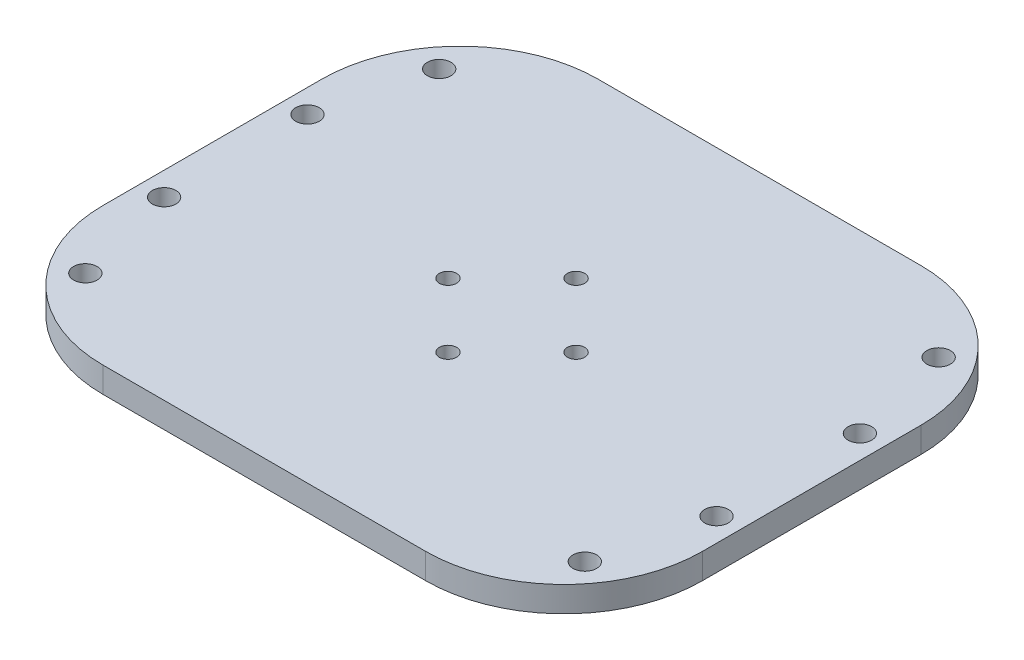
ISO-10303-21;
HEADER;
FILE_DESCRIPTION(('STEP AP214'),'2;1');
FILE_NAME('part.step','',(''),(''),'','','');
FILE_SCHEMA(('AUTOMOTIVE_DESIGN { 1 0 10303 214 1 1 1 1 }'));
ENDSEC;
DATA;
#1=APPLICATION_CONTEXT('core data for automotive mechanical design processes');
#2=APPLICATION_PROTOCOL_DEFINITION('international standard','automotive_design',2000,#1);
#3=PRODUCT_CONTEXT('',#1,'mechanical');
#4=PRODUCT('Part','Part','',(#3));
#5=PRODUCT_RELATED_PRODUCT_CATEGORY('part','',(#4));
#6=PRODUCT_DEFINITION_FORMATION('','',#4);
#7=PRODUCT_DEFINITION_CONTEXT('part definition',#1,'design');
#8=PRODUCT_DEFINITION('design','',#6,#7);
#9=PRODUCT_DEFINITION_SHAPE('','',#8);
#10=(LENGTH_UNIT() NAMED_UNIT(*) SI_UNIT(.MILLI.,.METRE.));
#11=(NAMED_UNIT(*) PLANE_ANGLE_UNIT() SI_UNIT($,.RADIAN.));
#12=(NAMED_UNIT(*) SI_UNIT($,.STERADIAN.) SOLID_ANGLE_UNIT());
#13=UNCERTAINTY_MEASURE_WITH_UNIT(LENGTH_MEASURE(1.E-05),#10,'distance_accuracy_value','');
#14=(GEOMETRIC_REPRESENTATION_CONTEXT(3) GLOBAL_UNCERTAINTY_ASSIGNED_CONTEXT((#13)) GLOBAL_UNIT_ASSIGNED_CONTEXT((#10,
#11,#12)) REPRESENTATION_CONTEXT('',''));
#15=CARTESIAN_POINT('',(0.,0.,0.));
#16=DIRECTION('',(0.,0.,1.));
#17=DIRECTION('',(1.,0.,0.));
#18=AXIS2_PLACEMENT_3D('',#15,#16,#17);
#19=CARTESIAN_POINT('',(20.150112608,3.175,-13.647712608));
#20=DIRECTION('',(0.,-1.,0.));
#21=DIRECTION('',(0.,0.,-1.));
#22=AXIS2_PLACEMENT_3D('',#19,#20,#21);
#23=CYLINDRICAL_SURFACE('',#22,17.276787392);
#24=CARTESIAN_POINT('',(20.150112608,0.,-13.647712608));
#25=DIRECTION('',(0.,1.,0.));
#26=DIRECTION('',(0.,0.,1.));
#27=AXIS2_PLACEMENT_3D('',#24,#25,#26);
#28=CIRCLE('',#27,17.276787392);
#29=CARTESIAN_POINT('',(37.4269,0.,-13.647712608));
#30=VERTEX_POINT('',#29);
#31=CARTESIAN_POINT('',(20.150112608,0.,-30.9245));
#32=VERTEX_POINT('',#31);
#33=EDGE_CURVE('E128',#30,#32,#28,.T.);
#34=ORIENTED_EDGE('',*,*,#33,.T.);
#35=DIRECTION('',(0.,-1.,0.));
#36=VECTOR('',#35,1.);
#37=CARTESIAN_POINT('',(20.150112608,3.175,-30.9245));
#38=LINE('',#37,#36);
#39=CARTESIAN_POINT('',(20.150112608,3.175,-30.9245));
#40=VERTEX_POINT('',#39);
#41=EDGE_CURVE('E11',#40,#32,#38,.T.);
#42=ORIENTED_EDGE('',*,*,#41,.F.);
#43=CARTESIAN_POINT('',(20.150112608,3.175,-13.647712608));
#44=DIRECTION('',(0.,1.,0.));
#45=DIRECTION('',(0.,0.,1.));
#46=AXIS2_PLACEMENT_3D('',#43,#44,#45);
#47=CIRCLE('',#46,17.276787392);
#48=CARTESIAN_POINT('',(37.4269,3.175,-13.647712608));
#49=VERTEX_POINT('',#48);
#50=EDGE_CURVE('E143',#49,#40,#47,.T.);
#51=ORIENTED_EDGE('',*,*,#50,.F.);
#52=DIRECTION('',(0.,-1.,0.));
#53=VECTOR('',#52,1.);
#54=CARTESIAN_POINT('',(37.4269,3.175,-13.647712608));
#55=LINE('',#54,#53);
#56=EDGE_CURVE('E124',#49,#30,#55,.T.);
#57=ORIENTED_EDGE('',*,*,#56,.T.);
#58=EDGE_LOOP('',(#34,#42,#51,#57));
#59=FACE_BOUND('',#58,.T.);
#60=ADVANCED_FACE('F32',(#59),#23,.T.);
#61=CARTESIAN_POINT('',(20.150112608,3.175,-30.9245));
#62=DIRECTION('',(0.,0.,1.));
#63=DIRECTION('',(1.,0.,0.));
#64=AXIS2_PLACEMENT_3D('',#61,#62,#63);
#65=PLANE('',#64);
#66=DIRECTION('',(-1.,0.,0.));
#67=VECTOR('',#66,1.);
#68=CARTESIAN_POINT('',(20.150112608,0.,-30.9245));
#69=LINE('',#68,#67);
#70=CARTESIAN_POINT('',(-20.150112608,0.,-30.9245));
#71=VERTEX_POINT('',#70);
#72=EDGE_CURVE('E131',#32,#71,#69,.T.);
#73=ORIENTED_EDGE('',*,*,#72,.T.);
#74=DIRECTION('',(0.,-1.,0.));
#75=VECTOR('',#74,1.);
#76=CARTESIAN_POINT('',(-20.150112608,3.175,-30.9245));
#77=LINE('',#76,#75);
#78=CARTESIAN_POINT('',(-20.150112608,3.175,-30.9245));
#79=VERTEX_POINT('',#78);
#80=EDGE_CURVE('E40',#79,#71,#77,.T.);
#81=ORIENTED_EDGE('',*,*,#80,.F.);
#82=DIRECTION('',(-1.,0.,0.));
#83=VECTOR('',#82,1.);
#84=CARTESIAN_POINT('',(20.150112608,3.175,-30.9245));
#85=LINE('',#84,#83);
#86=EDGE_CURVE('E91',#40,#79,#85,.T.);
#87=ORIENTED_EDGE('',*,*,#86,.F.);
#88=ORIENTED_EDGE('',*,*,#41,.T.);
#89=EDGE_LOOP('',(#73,#81,#87,#88));
#90=FACE_BOUND('',#89,.T.);
#91=ADVANCED_FACE('F292',(#90),#65,.F.);
#92=CARTESIAN_POINT('',(-20.150112608,3.175,-13.647712608));
#93=DIRECTION('',(0.,-1.,0.));
#94=DIRECTION('',(0.,0.,-1.));
#95=AXIS2_PLACEMENT_3D('',#92,#93,#94);
#96=CYLINDRICAL_SURFACE('',#95,17.276787392);
#97=CARTESIAN_POINT('',(-20.150112608,0.,-13.647712608));
#98=DIRECTION('',(0.,1.,0.));
#99=DIRECTION('',(0.,0.,1.));
#100=AXIS2_PLACEMENT_3D('',#97,#98,#99);
#101=CIRCLE('',#100,17.276787392);
#102=CARTESIAN_POINT('',(-37.4269,0.,-13.647712608));
#103=VERTEX_POINT('',#102);
#104=EDGE_CURVE('E134',#71,#103,#101,.T.);
#105=ORIENTED_EDGE('',*,*,#104,.T.);
#106=DIRECTION('',(0.,-1.,0.));
#107=VECTOR('',#106,1.);
#108=CARTESIAN_POINT('',(-37.4269,3.175,-13.647712608));
#109=LINE('',#108,#107);
#110=CARTESIAN_POINT('',(-37.4269,3.175,-13.647712608));
#111=VERTEX_POINT('',#110);
#112=EDGE_CURVE('E150',#111,#103,#109,.T.);
#113=ORIENTED_EDGE('',*,*,#112,.F.);
#114=CARTESIAN_POINT('',(-20.150112608,3.175,-13.647712608));
#115=DIRECTION('',(0.,1.,0.));
#116=DIRECTION('',(0.,0.,1.));
#117=AXIS2_PLACEMENT_3D('',#114,#115,#116);
#118=CIRCLE('',#117,17.276787392);
#119=EDGE_CURVE('E158',#79,#111,#118,.T.);
#120=ORIENTED_EDGE('',*,*,#119,.F.);
#121=ORIENTED_EDGE('',*,*,#80,.T.);
#122=EDGE_LOOP('',(#105,#113,#120,#121));
#123=FACE_BOUND('',#122,.T.);
#124=ADVANCED_FACE('F156',(#123),#96,.T.);
#125=CARTESIAN_POINT('',(-37.4269,3.175,13.647712608));
#126=DIRECTION('',(1.,0.,0.));
#127=DIRECTION('',(0.,0.,-1.));
#128=AXIS2_PLACEMENT_3D('',#125,#126,#127);
#129=PLANE('',#128);
#130=DIRECTION('',(0.,0.,1.));
#131=VECTOR('',#130,1.);
#132=CARTESIAN_POINT('',(-37.4269,0.,13.647712608));
#133=LINE('',#132,#131);
#134=CARTESIAN_POINT('',(-37.4269,0.,13.647712608));
#135=VERTEX_POINT('',#134);
#136=EDGE_CURVE('E136',#103,#135,#133,.T.);
#137=ORIENTED_EDGE('',*,*,#136,.T.);
#138=DIRECTION('',(0.,-1.,0.));
#139=VECTOR('',#138,1.);
#140=CARTESIAN_POINT('',(-37.4269,3.175,13.647712608));
#141=LINE('',#140,#139);
#142=CARTESIAN_POINT('',(-37.4269,3.175,13.647712608));
#143=VERTEX_POINT('',#142);
#144=EDGE_CURVE('E147',#143,#135,#141,.T.);
#145=ORIENTED_EDGE('',*,*,#144,.F.);
#146=DIRECTION('',(0.,0.,1.));
#147=VECTOR('',#146,1.);
#148=CARTESIAN_POINT('',(-37.4269,3.175,13.647712608));
#149=LINE('',#148,#147);
#150=EDGE_CURVE('E170',#111,#143,#149,.T.);
#151=ORIENTED_EDGE('',*,*,#150,.F.);
#152=ORIENTED_EDGE('',*,*,#112,.T.);
#153=EDGE_LOOP('',(#137,#145,#151,#152));
#154=FACE_BOUND('',#153,.T.);
#155=ADVANCED_FACE('F166',(#154),#129,.F.);
#156=CARTESIAN_POINT('',(-20.150112608,3.175,13.647712608));
#157=DIRECTION('',(0.,-1.,0.));
#158=DIRECTION('',(0.,0.,-1.));
#159=AXIS2_PLACEMENT_3D('',#156,#157,#158);
#160=CYLINDRICAL_SURFACE('',#159,17.276787392);
#161=CARTESIAN_POINT('',(-20.150112608,0.,13.647712608));
#162=DIRECTION('',(0.,1.,0.));
#163=DIRECTION('',(0.,0.,-1.));
#164=AXIS2_PLACEMENT_3D('',#161,#162,#163);
#165=CIRCLE('',#164,17.276787392);
#166=CARTESIAN_POINT('',(-20.150112608,0.,30.9245));
#167=VERTEX_POINT('',#166);
#168=EDGE_CURVE('E138',#135,#167,#165,.T.);
#169=ORIENTED_EDGE('',*,*,#168,.T.);
#170=DIRECTION('',(0.,-1.,0.));
#171=VECTOR('',#170,1.);
#172=CARTESIAN_POINT('',(-20.150112608,3.175,30.9245));
#173=LINE('',#172,#171);
#174=CARTESIAN_POINT('',(-20.150112608,3.175,30.9245));
#175=VERTEX_POINT('',#174);
#176=EDGE_CURVE('E119',#175,#167,#173,.T.);
#177=ORIENTED_EDGE('',*,*,#176,.F.);
#178=CARTESIAN_POINT('',(-20.150112608,3.175,13.647712608));
#179=DIRECTION('',(0.,1.,0.));
#180=DIRECTION('',(0.,0.,-1.));
#181=AXIS2_PLACEMENT_3D('',#178,#179,#180);
#182=CIRCLE('',#181,17.276787392);
#183=EDGE_CURVE('E110',#143,#175,#182,.T.);
#184=ORIENTED_EDGE('',*,*,#183,.F.);
#185=ORIENTED_EDGE('',*,*,#144,.T.);
#186=EDGE_LOOP('',(#169,#177,#184,#185));
#187=FACE_BOUND('',#186,.T.);
#188=ADVANCED_FACE('F169',(#187),#160,.T.);
#189=CARTESIAN_POINT('',(20.150112608,3.175,30.9245));
#190=DIRECTION('',(0.,0.,-1.));
#191=DIRECTION('',(-1.,0.,0.));
#192=AXIS2_PLACEMENT_3D('',#189,#190,#191);
#193=PLANE('',#192);
#194=DIRECTION('',(1.,0.,0.));
#195=VECTOR('',#194,1.);
#196=CARTESIAN_POINT('',(20.150112608,0.,30.9245));
#197=LINE('',#196,#195);
#198=CARTESIAN_POINT('',(20.150112608,0.,30.9245));
#199=VERTEX_POINT('',#198);
#200=EDGE_CURVE('E118',#167,#199,#197,.T.);
#201=ORIENTED_EDGE('',*,*,#200,.T.);
#202=DIRECTION('',(0.,-1.,0.));
#203=VECTOR('',#202,1.);
#204=CARTESIAN_POINT('',(20.150112608,3.175,30.9245));
#205=LINE('',#204,#203);
#206=CARTESIAN_POINT('',(20.150112608,3.175,30.9245));
#207=VERTEX_POINT('',#206);
#208=EDGE_CURVE('E115',#207,#199,#205,.T.);
#209=ORIENTED_EDGE('',*,*,#208,.F.);
#210=DIRECTION('',(1.,0.,0.));
#211=VECTOR('',#210,1.);
#212=CARTESIAN_POINT('',(20.150112608,3.175,30.9245));
#213=LINE('',#212,#211);
#214=EDGE_CURVE('E104',#175,#207,#213,.T.);
#215=ORIENTED_EDGE('',*,*,#214,.F.);
#216=ORIENTED_EDGE('',*,*,#176,.T.);
#217=EDGE_LOOP('',(#201,#209,#215,#216));
#218=FACE_BOUND('',#217,.T.);
#219=ADVANCED_FACE('F116',(#218),#193,.F.);
#220=CARTESIAN_POINT('',(20.150112608,3.175,13.647712608));
#221=DIRECTION('',(0.,-1.,0.));
#222=DIRECTION('',(0.,0.,-1.));
#223=AXIS2_PLACEMENT_3D('',#220,#221,#222);
#224=CYLINDRICAL_SURFACE('',#223,17.276787392);
#225=CARTESIAN_POINT('',(20.150112608,0.,13.647712608));
#226=DIRECTION('',(0.,1.,0.));
#227=DIRECTION('',(0.,0.,1.));
#228=AXIS2_PLACEMENT_3D('',#225,#226,#227);
#229=CIRCLE('',#228,17.276787392);
#230=CARTESIAN_POINT('',(37.4269,0.,13.647712608));
#231=VERTEX_POINT('',#230);
#232=EDGE_CURVE('E77',#199,#231,#229,.T.);
#233=ORIENTED_EDGE('',*,*,#232,.T.);
#234=DIRECTION('',(0.,-1.,0.));
#235=VECTOR('',#234,1.);
#236=CARTESIAN_POINT('',(37.4269,3.175,13.647712608));
#237=LINE('',#236,#235);
#238=CARTESIAN_POINT('',(37.4269,3.175,13.647712608));
#239=VERTEX_POINT('',#238);
#240=EDGE_CURVE('E120',#239,#231,#237,.T.);
#241=ORIENTED_EDGE('',*,*,#240,.F.);
#242=CARTESIAN_POINT('',(20.150112608,3.175,13.647712608));
#243=DIRECTION('',(0.,1.,0.));
#244=DIRECTION('',(0.,0.,1.));
#245=AXIS2_PLACEMENT_3D('',#242,#243,#244);
#246=CIRCLE('',#245,17.276787392);
#247=EDGE_CURVE('E108',#207,#239,#246,.T.);
#248=ORIENTED_EDGE('',*,*,#247,.F.);
#249=ORIENTED_EDGE('',*,*,#208,.T.);
#250=EDGE_LOOP('',(#233,#241,#248,#249));
#251=FACE_BOUND('',#250,.T.);
#252=ADVANCED_FACE('F122',(#251),#224,.T.);
#253=CARTESIAN_POINT('',(37.4269,3.175,13.647712608));
#254=DIRECTION('',(-1.,0.,0.));
#255=DIRECTION('',(0.,0.,1.));
#256=AXIS2_PLACEMENT_3D('',#253,#254,#255);
#257=PLANE('',#256);
#258=DIRECTION('',(0.,0.,-1.));
#259=VECTOR('',#258,1.);
#260=CARTESIAN_POINT('',(37.4269,0.,13.647712608));
#261=LINE('',#260,#259);
#262=EDGE_CURVE('E83',#231,#30,#261,.T.);
#263=ORIENTED_EDGE('',*,*,#262,.T.);
#264=ORIENTED_EDGE('',*,*,#56,.F.);
#265=DIRECTION('',(0.,0.,-1.));
#266=VECTOR('',#265,1.);
#267=CARTESIAN_POINT('',(37.4269,3.175,13.647712608));
#268=LINE('',#267,#266);
#269=EDGE_CURVE('E48',#239,#49,#268,.T.);
#270=ORIENTED_EDGE('',*,*,#269,.F.);
#271=ORIENTED_EDGE('',*,*,#240,.T.);
#272=EDGE_LOOP('',(#263,#264,#270,#271));
#273=FACE_BOUND('',#272,.T.);
#274=ADVANCED_FACE('F252',(#273),#257,.F.);
#275=CARTESIAN_POINT('',(20.150112608,3.175,-13.647712608));
#276=DIRECTION('',(0.,1.,0.));
#277=DIRECTION('',(0.,0.,1.));
#278=AXIS2_PLACEMENT_3D('',#275,#276,#277);
#279=PLANE('',#278);
#280=CARTESIAN_POINT('',(-31.1912,3.175,-22.098));
#281=DIRECTION('',(0.,1.,0.));
#282=DIRECTION('',(0.,0.,1.));
#283=AXIS2_PLACEMENT_3D('',#280,#281,#282);
#284=CIRCLE('',#283,1.4732);
#285=CARTESIAN_POINT('',(-31.1912,3.175,-20.6248));
#286=VERTEX_POINT('',#285);
#287=EDGE_CURVE('E244',#286,#286,#284,.T.);
#288=ORIENTED_EDGE('',*,*,#287,.F.);
#289=EDGE_LOOP('',(#288));
#290=FACE_BOUND('',#289,.T.);
#291=CARTESIAN_POINT('',(31.1912,3.175,-22.098));
#292=DIRECTION('',(0.,1.,0.));
#293=DIRECTION('',(0.,0.,1.));
#294=AXIS2_PLACEMENT_3D('',#291,#292,#293);
#295=CIRCLE('',#294,1.4732);
#296=CARTESIAN_POINT('',(31.1912,3.175,-20.6248));
#297=VERTEX_POINT('',#296);
#298=EDGE_CURVE('E238',#297,#297,#295,.T.);
#299=ORIENTED_EDGE('',*,*,#298,.F.);
#300=EDGE_LOOP('',(#299));
#301=FACE_BOUND('',#300,.T.);
#302=CARTESIAN_POINT('',(31.1912,3.175,22.098));
#303=DIRECTION('',(0.,1.,0.));
#304=DIRECTION('',(0.,0.,1.));
#305=AXIS2_PLACEMENT_3D('',#302,#303,#304);
#306=CIRCLE('',#305,1.4732);
#307=CARTESIAN_POINT('',(31.1912,3.175,23.5712));
#308=VERTEX_POINT('',#307);
#309=EDGE_CURVE('E232',#308,#308,#306,.T.);
#310=ORIENTED_EDGE('',*,*,#309,.F.);
#311=EDGE_LOOP('',(#310));
#312=FACE_BOUND('',#311,.T.);
#313=CARTESIAN_POINT('',(-31.1912,3.175,22.098));
#314=DIRECTION('',(0.,1.,0.));
#315=DIRECTION('',(0.,0.,1.));
#316=AXIS2_PLACEMENT_3D('',#313,#314,#315);
#317=CIRCLE('',#316,1.4732);
#318=CARTESIAN_POINT('',(-31.1912,3.175,23.5712));
#319=VERTEX_POINT('',#318);
#320=EDGE_CURVE('E226',#319,#319,#317,.T.);
#321=ORIENTED_EDGE('',*,*,#320,.F.);
#322=EDGE_LOOP('',(#321));
#323=FACE_BOUND('',#322,.T.);
#324=CARTESIAN_POINT('',(-34.5,3.175,-8.9535));
#325=DIRECTION('',(0.,1.,0.));
#326=DIRECTION('',(0.,0.,1.));
#327=AXIS2_PLACEMENT_3D('',#324,#325,#326);
#328=CIRCLE('',#327,1.4732);
#329=CARTESIAN_POINT('',(-34.5,3.175,-7.4803));
#330=VERTEX_POINT('',#329);
#331=EDGE_CURVE('E220',#330,#330,#328,.T.);
#332=ORIENTED_EDGE('',*,*,#331,.F.);
#333=EDGE_LOOP('',(#332));
#334=FACE_BOUND('',#333,.T.);
#335=CARTESIAN_POINT('',(-34.5,3.175,8.9535));
#336=DIRECTION('',(0.,1.,0.));
#337=DIRECTION('',(0.,0.,1.));
#338=AXIS2_PLACEMENT_3D('',#335,#336,#337);
#339=CIRCLE('',#338,1.4732);
#340=CARTESIAN_POINT('',(-34.5,3.175,10.4267));
#341=VERTEX_POINT('',#340);
#342=EDGE_CURVE('E214',#341,#341,#339,.T.);
#343=ORIENTED_EDGE('',*,*,#342,.F.);
#344=EDGE_LOOP('',(#343));
#345=FACE_BOUND('',#344,.T.);
#346=CARTESIAN_POINT('',(34.5,3.175,8.9535));
#347=DIRECTION('',(0.,1.,0.));
#348=DIRECTION('',(0.,0.,1.));
#349=AXIS2_PLACEMENT_3D('',#346,#347,#348);
#350=CIRCLE('',#349,1.4732);
#351=CARTESIAN_POINT('',(34.5,3.175,10.4267));
#352=VERTEX_POINT('',#351);
#353=EDGE_CURVE('E208',#352,#352,#350,.T.);
#354=ORIENTED_EDGE('',*,*,#353,.F.);
#355=EDGE_LOOP('',(#354));
#356=FACE_BOUND('',#355,.T.);
#357=CARTESIAN_POINT('',(34.5,3.175,-8.9535));
#358=DIRECTION('',(0.,1.,0.));
#359=DIRECTION('',(0.,0.,1.));
#360=AXIS2_PLACEMENT_3D('',#357,#358,#359);
#361=CIRCLE('',#360,1.4732);
#362=CARTESIAN_POINT('',(34.5,3.175,-7.4803));
#363=VERTEX_POINT('',#362);
#364=EDGE_CURVE('E202',#363,#363,#361,.T.);
#365=ORIENTED_EDGE('',*,*,#364,.F.);
#366=EDGE_LOOP('',(#365));
#367=FACE_BOUND('',#366,.T.);
#368=CARTESIAN_POINT('',(0.,3.175,-8.));
#369=DIRECTION('',(0.,1.,0.));
#370=DIRECTION('',(0.,0.,1.));
#371=AXIS2_PLACEMENT_3D('',#368,#369,#370);
#372=CIRCLE('',#371,1.0795);
#373=CARTESIAN_POINT('',(0.,3.175,-6.9205));
#374=VERTEX_POINT('',#373);
#375=EDGE_CURVE('E196',#374,#374,#372,.T.);
#376=ORIENTED_EDGE('',*,*,#375,.F.);
#377=EDGE_LOOP('',(#376));
#378=FACE_BOUND('',#377,.T.);
#379=CARTESIAN_POINT('',(8.,3.175,0.));
#380=DIRECTION('',(0.,1.,0.));
#381=DIRECTION('',(0.,0.,1.));
#382=AXIS2_PLACEMENT_3D('',#379,#380,#381);
#383=CIRCLE('',#382,1.0795);
#384=CARTESIAN_POINT('',(8.,3.175,1.0795));
#385=VERTEX_POINT('',#384);
#386=EDGE_CURVE('E190',#385,#385,#383,.T.);
#387=ORIENTED_EDGE('',*,*,#386,.F.);
#388=EDGE_LOOP('',(#387));
#389=FACE_BOUND('',#388,.T.);
#390=CARTESIAN_POINT('',(0.,3.175,8.));
#391=DIRECTION('',(0.,1.,0.));
#392=DIRECTION('',(0.,0.,1.));
#393=AXIS2_PLACEMENT_3D('',#390,#391,#392);
#394=CIRCLE('',#393,1.0795);
#395=CARTESIAN_POINT('',(0.,3.175,9.0795));
#396=VERTEX_POINT('',#395);
#397=EDGE_CURVE('E184',#396,#396,#394,.T.);
#398=ORIENTED_EDGE('',*,*,#397,.F.);
#399=EDGE_LOOP('',(#398));
#400=FACE_BOUND('',#399,.T.);
#401=CARTESIAN_POINT('',(-8.,3.175,0.));
#402=DIRECTION('',(0.,1.,0.));
#403=DIRECTION('',(0.,0.,1.));
#404=AXIS2_PLACEMENT_3D('',#401,#402,#403);
#405=CIRCLE('',#404,1.0795);
#406=CARTESIAN_POINT('',(-8.,3.175,1.0795));
#407=VERTEX_POINT('',#406);
#408=EDGE_CURVE('E178',#407,#407,#405,.T.);
#409=ORIENTED_EDGE('',*,*,#408,.F.);
#410=EDGE_LOOP('',(#409));
#411=FACE_BOUND('',#410,.T.);
#412=ORIENTED_EDGE('',*,*,#50,.T.);
#413=ORIENTED_EDGE('',*,*,#86,.T.);
#414=ORIENTED_EDGE('',*,*,#119,.T.);
#415=ORIENTED_EDGE('',*,*,#150,.T.);
#416=ORIENTED_EDGE('',*,*,#183,.T.);
#417=ORIENTED_EDGE('',*,*,#214,.T.);
#418=ORIENTED_EDGE('',*,*,#247,.T.);
#419=ORIENTED_EDGE('',*,*,#269,.T.);
#420=EDGE_LOOP('',(#412,#413,#414,#415,#416,#417,#418,#419));
#421=FACE_BOUND('',#420,.T.);
#422=ADVANCED_FACE('F106',(#290,#301,#312,#323,#334,#345,#356,#367,#378,#389,#400,#411,#421),
#279,.T.);
#423=CARTESIAN_POINT('',(20.150112608,0.,-13.647712608));
#424=DIRECTION('',(0.,1.,0.));
#425=DIRECTION('',(0.,0.,1.));
#426=AXIS2_PLACEMENT_3D('',#423,#424,#425);
#427=PLANE('',#426);
#428=CARTESIAN_POINT('',(-31.1912,0.,-22.098));
#429=DIRECTION('',(0.,1.,0.));
#430=DIRECTION('',(0.,0.,1.));
#431=AXIS2_PLACEMENT_3D('',#428,#429,#430);
#432=CIRCLE('',#431,1.4732);
#433=CARTESIAN_POINT('',(-31.1912,0.,-20.6248));
#434=VERTEX_POINT('',#433);
#435=EDGE_CURVE('E241',#434,#434,#432,.T.);
#436=ORIENTED_EDGE('',*,*,#435,.T.);
#437=EDGE_LOOP('',(#436));
#438=FACE_BOUND('',#437,.T.);
#439=CARTESIAN_POINT('',(31.1912,0.,-22.098));
#440=DIRECTION('',(0.,1.,0.));
#441=DIRECTION('',(0.,0.,1.));
#442=AXIS2_PLACEMENT_3D('',#439,#440,#441);
#443=CIRCLE('',#442,1.4732);
#444=CARTESIAN_POINT('',(31.1912,0.,-20.6248));
#445=VERTEX_POINT('',#444);
#446=EDGE_CURVE('E235',#445,#445,#443,.T.);
#447=ORIENTED_EDGE('',*,*,#446,.T.);
#448=EDGE_LOOP('',(#447));
#449=FACE_BOUND('',#448,.T.);
#450=CARTESIAN_POINT('',(31.1912,0.,22.098));
#451=DIRECTION('',(0.,1.,0.));
#452=DIRECTION('',(0.,0.,1.));
#453=AXIS2_PLACEMENT_3D('',#450,#451,#452);
#454=CIRCLE('',#453,1.4732);
#455=CARTESIAN_POINT('',(31.1912,0.,23.5712));
#456=VERTEX_POINT('',#455);
#457=EDGE_CURVE('E229',#456,#456,#454,.T.);
#458=ORIENTED_EDGE('',*,*,#457,.T.);
#459=EDGE_LOOP('',(#458));
#460=FACE_BOUND('',#459,.T.);
#461=CARTESIAN_POINT('',(-31.1912,0.,22.098));
#462=DIRECTION('',(0.,1.,0.));
#463=DIRECTION('',(0.,0.,1.));
#464=AXIS2_PLACEMENT_3D('',#461,#462,#463);
#465=CIRCLE('',#464,1.4732);
#466=CARTESIAN_POINT('',(-31.1912,0.,23.5712));
#467=VERTEX_POINT('',#466);
#468=EDGE_CURVE('E223',#467,#467,#465,.T.);
#469=ORIENTED_EDGE('',*,*,#468,.T.);
#470=EDGE_LOOP('',(#469));
#471=FACE_BOUND('',#470,.T.);
#472=CARTESIAN_POINT('',(-34.5,0.,-8.9535));
#473=DIRECTION('',(0.,1.,0.));
#474=DIRECTION('',(0.,0.,1.));
#475=AXIS2_PLACEMENT_3D('',#472,#473,#474);
#476=CIRCLE('',#475,1.4732);
#477=CARTESIAN_POINT('',(-34.5,0.,-7.4803));
#478=VERTEX_POINT('',#477);
#479=EDGE_CURVE('E217',#478,#478,#476,.T.);
#480=ORIENTED_EDGE('',*,*,#479,.T.);
#481=EDGE_LOOP('',(#480));
#482=FACE_BOUND('',#481,.T.);
#483=CARTESIAN_POINT('',(-34.5,0.,8.9535));
#484=DIRECTION('',(0.,1.,0.));
#485=DIRECTION('',(0.,0.,1.));
#486=AXIS2_PLACEMENT_3D('',#483,#484,#485);
#487=CIRCLE('',#486,1.4732);
#488=CARTESIAN_POINT('',(-34.5,0.,10.4267));
#489=VERTEX_POINT('',#488);
#490=EDGE_CURVE('E211',#489,#489,#487,.T.);
#491=ORIENTED_EDGE('',*,*,#490,.T.);
#492=EDGE_LOOP('',(#491));
#493=FACE_BOUND('',#492,.T.);
#494=CARTESIAN_POINT('',(34.5,0.,8.9535));
#495=DIRECTION('',(0.,1.,0.));
#496=DIRECTION('',(0.,0.,1.));
#497=AXIS2_PLACEMENT_3D('',#494,#495,#496);
#498=CIRCLE('',#497,1.4732);
#499=CARTESIAN_POINT('',(34.5,0.,10.4267));
#500=VERTEX_POINT('',#499);
#501=EDGE_CURVE('E205',#500,#500,#498,.T.);
#502=ORIENTED_EDGE('',*,*,#501,.T.);
#503=EDGE_LOOP('',(#502));
#504=FACE_BOUND('',#503,.T.);
#505=CARTESIAN_POINT('',(34.5,0.,-8.9535));
#506=DIRECTION('',(0.,1.,0.));
#507=DIRECTION('',(0.,0.,1.));
#508=AXIS2_PLACEMENT_3D('',#505,#506,#507);
#509=CIRCLE('',#508,1.4732);
#510=CARTESIAN_POINT('',(34.5,0.,-7.4803));
#511=VERTEX_POINT('',#510);
#512=EDGE_CURVE('E199',#511,#511,#509,.T.);
#513=ORIENTED_EDGE('',*,*,#512,.T.);
#514=EDGE_LOOP('',(#513));
#515=FACE_BOUND('',#514,.T.);
#516=CARTESIAN_POINT('',(0.,0.,-8.));
#517=DIRECTION('',(0.,1.,0.));
#518=DIRECTION('',(0.,0.,1.));
#519=AXIS2_PLACEMENT_3D('',#516,#517,#518);
#520=CIRCLE('',#519,1.0795);
#521=CARTESIAN_POINT('',(0.,0.,-6.9205));
#522=VERTEX_POINT('',#521);
#523=EDGE_CURVE('E193',#522,#522,#520,.T.);
#524=ORIENTED_EDGE('',*,*,#523,.T.);
#525=EDGE_LOOP('',(#524));
#526=FACE_BOUND('',#525,.T.);
#527=CARTESIAN_POINT('',(8.,0.,0.));
#528=DIRECTION('',(0.,1.,0.));
#529=DIRECTION('',(0.,0.,1.));
#530=AXIS2_PLACEMENT_3D('',#527,#528,#529);
#531=CIRCLE('',#530,1.0795);
#532=CARTESIAN_POINT('',(8.,0.,1.0795));
#533=VERTEX_POINT('',#532);
#534=EDGE_CURVE('E187',#533,#533,#531,.T.);
#535=ORIENTED_EDGE('',*,*,#534,.T.);
#536=EDGE_LOOP('',(#535));
#537=FACE_BOUND('',#536,.T.);
#538=CARTESIAN_POINT('',(0.,0.,8.));
#539=DIRECTION('',(0.,1.,0.));
#540=DIRECTION('',(0.,0.,1.));
#541=AXIS2_PLACEMENT_3D('',#538,#539,#540);
#542=CIRCLE('',#541,1.0795);
#543=CARTESIAN_POINT('',(0.,0.,9.0795));
#544=VERTEX_POINT('',#543);
#545=EDGE_CURVE('E181',#544,#544,#542,.T.);
#546=ORIENTED_EDGE('',*,*,#545,.T.);
#547=EDGE_LOOP('',(#546));
#548=FACE_BOUND('',#547,.T.);
#549=CARTESIAN_POINT('',(-8.,0.,0.));
#550=DIRECTION('',(0.,1.,0.));
#551=DIRECTION('',(0.,0.,1.));
#552=AXIS2_PLACEMENT_3D('',#549,#550,#551);
#553=CIRCLE('',#552,1.0795);
#554=CARTESIAN_POINT('',(-8.,0.,1.0795));
#555=VERTEX_POINT('',#554);
#556=EDGE_CURVE('E132',#555,#555,#553,.T.);
#557=ORIENTED_EDGE('',*,*,#556,.T.);
#558=EDGE_LOOP('',(#557));
#559=FACE_BOUND('',#558,.T.);
#560=ORIENTED_EDGE('',*,*,#33,.F.);
#561=ORIENTED_EDGE('',*,*,#262,.F.);
#562=ORIENTED_EDGE('',*,*,#232,.F.);
#563=ORIENTED_EDGE('',*,*,#200,.F.);
#564=ORIENTED_EDGE('',*,*,#168,.F.);
#565=ORIENTED_EDGE('',*,*,#136,.F.);
#566=ORIENTED_EDGE('',*,*,#104,.F.);
#567=ORIENTED_EDGE('',*,*,#72,.F.);
#568=EDGE_LOOP('',(#560,#561,#562,#563,#564,#565,#566,#567));
#569=FACE_BOUND('',#568,.T.);
#570=ADVANCED_FACE('F162',(#438,#449,#460,#471,#482,#493,#504,#515,#526,#537,#548,#559,#569),
#427,.F.);
#571=CARTESIAN_POINT('',(-8.,3.175,0.));
#572=DIRECTION('',(0.,1.,0.));
#573=DIRECTION('',(0.,0.,1.));
#574=AXIS2_PLACEMENT_3D('',#571,#572,#573);
#575=CYLINDRICAL_SURFACE('',#574,1.0795);
#576=ORIENTED_EDGE('',*,*,#556,.F.);
#577=EDGE_LOOP('',(#576));
#578=FACE_BOUND('',#577,.T.);
#579=ORIENTED_EDGE('',*,*,#408,.T.);
#580=EDGE_LOOP('',(#579));
#581=FACE_BOUND('',#580,.T.);
#582=ADVANCED_FACE('F276',(#578,#581),#575,.F.);
#583=CARTESIAN_POINT('',(0.,3.175,8.));
#584=DIRECTION('',(0.,1.,0.));
#585=DIRECTION('',(0.,0.,1.));
#586=AXIS2_PLACEMENT_3D('',#583,#584,#585);
#587=CYLINDRICAL_SURFACE('',#586,1.0795);
#588=ORIENTED_EDGE('',*,*,#545,.F.);
#589=EDGE_LOOP('',(#588));
#590=FACE_BOUND('',#589,.T.);
#591=ORIENTED_EDGE('',*,*,#397,.T.);
#592=EDGE_LOOP('',(#591));
#593=FACE_BOUND('',#592,.T.);
#594=ADVANCED_FACE('F278',(#590,#593),#587,.F.);
#595=CARTESIAN_POINT('',(8.,3.175,0.));
#596=DIRECTION('',(0.,1.,0.));
#597=DIRECTION('',(0.,0.,1.));
#598=AXIS2_PLACEMENT_3D('',#595,#596,#597);
#599=CYLINDRICAL_SURFACE('',#598,1.0795);
#600=ORIENTED_EDGE('',*,*,#534,.F.);
#601=EDGE_LOOP('',(#600));
#602=FACE_BOUND('',#601,.T.);
#603=ORIENTED_EDGE('',*,*,#386,.T.);
#604=EDGE_LOOP('',(#603));
#605=FACE_BOUND('',#604,.T.);
#606=ADVANCED_FACE('F285',(#602,#605),#599,.F.);
#607=CARTESIAN_POINT('',(0.,3.175,-8.));
#608=DIRECTION('',(0.,1.,0.));
#609=DIRECTION('',(0.,0.,1.));
#610=AXIS2_PLACEMENT_3D('',#607,#608,#609);
#611=CYLINDRICAL_SURFACE('',#610,1.0795);
#612=ORIENTED_EDGE('',*,*,#523,.F.);
#613=EDGE_LOOP('',(#612));
#614=FACE_BOUND('',#613,.T.);
#615=ORIENTED_EDGE('',*,*,#375,.T.);
#616=EDGE_LOOP('',(#615));
#617=FACE_BOUND('',#616,.T.);
#618=ADVANCED_FACE('F358',(#614,#617),#611,.F.);
#619=CARTESIAN_POINT('',(34.5,3.175,-8.9535));
#620=DIRECTION('',(0.,1.,0.));
#621=DIRECTION('',(0.,0.,1.));
#622=AXIS2_PLACEMENT_3D('',#619,#620,#621);
#623=CYLINDRICAL_SURFACE('',#622,1.4732);
#624=ORIENTED_EDGE('',*,*,#512,.F.);
#625=EDGE_LOOP('',(#624));
#626=FACE_BOUND('',#625,.T.);
#627=ORIENTED_EDGE('',*,*,#364,.T.);
#628=EDGE_LOOP('',(#627));
#629=FACE_BOUND('',#628,.T.);
#630=ADVANCED_FACE('F368',(#626,#629),#623,.F.);
#631=CARTESIAN_POINT('',(34.5,3.175,8.9535));
#632=DIRECTION('',(0.,1.,0.));
#633=DIRECTION('',(0.,0.,1.));
#634=AXIS2_PLACEMENT_3D('',#631,#632,#633);
#635=CYLINDRICAL_SURFACE('',#634,1.4732);
#636=ORIENTED_EDGE('',*,*,#501,.F.);
#637=EDGE_LOOP('',(#636));
#638=FACE_BOUND('',#637,.T.);
#639=ORIENTED_EDGE('',*,*,#353,.T.);
#640=EDGE_LOOP('',(#639));
#641=FACE_BOUND('',#640,.T.);
#642=ADVANCED_FACE('F388',(#638,#641),#635,.F.);
#643=CARTESIAN_POINT('',(-34.5,3.175,8.9535));
#644=DIRECTION('',(0.,1.,0.));
#645=DIRECTION('',(0.,0.,1.));
#646=AXIS2_PLACEMENT_3D('',#643,#644,#645);
#647=CYLINDRICAL_SURFACE('',#646,1.4732);
#648=ORIENTED_EDGE('',*,*,#490,.F.);
#649=EDGE_LOOP('',(#648));
#650=FACE_BOUND('',#649,.T.);
#651=ORIENTED_EDGE('',*,*,#342,.T.);
#652=EDGE_LOOP('',(#651));
#653=FACE_BOUND('',#652,.T.);
#654=ADVANCED_FACE('F398',(#650,#653),#647,.F.);
#655=CARTESIAN_POINT('',(-34.5,3.175,-8.9535));
#656=DIRECTION('',(0.,1.,0.));
#657=DIRECTION('',(0.,0.,1.));
#658=AXIS2_PLACEMENT_3D('',#655,#656,#657);
#659=CYLINDRICAL_SURFACE('',#658,1.4732);
#660=ORIENTED_EDGE('',*,*,#479,.F.);
#661=EDGE_LOOP('',(#660));
#662=FACE_BOUND('',#661,.T.);
#663=ORIENTED_EDGE('',*,*,#331,.T.);
#664=EDGE_LOOP('',(#663));
#665=FACE_BOUND('',#664,.T.);
#666=ADVANCED_FACE('F408',(#662,#665),#659,.F.);
#667=CARTESIAN_POINT('',(-31.1912,3.175,22.098));
#668=DIRECTION('',(0.,1.,0.));
#669=DIRECTION('',(0.,0.,1.));
#670=AXIS2_PLACEMENT_3D('',#667,#668,#669);
#671=CYLINDRICAL_SURFACE('',#670,1.4732);
#672=ORIENTED_EDGE('',*,*,#468,.F.);
#673=EDGE_LOOP('',(#672));
#674=FACE_BOUND('',#673,.T.);
#675=ORIENTED_EDGE('',*,*,#320,.T.);
#676=EDGE_LOOP('',(#675));
#677=FACE_BOUND('',#676,.T.);
#678=ADVANCED_FACE('F418',(#674,#677),#671,.F.);
#679=CARTESIAN_POINT('',(31.1912,3.175,22.098));
#680=DIRECTION('',(0.,1.,0.));
#681=DIRECTION('',(0.,0.,1.));
#682=AXIS2_PLACEMENT_3D('',#679,#680,#681);
#683=CYLINDRICAL_SURFACE('',#682,1.4732);
#684=ORIENTED_EDGE('',*,*,#457,.F.);
#685=EDGE_LOOP('',(#684));
#686=FACE_BOUND('',#685,.T.);
#687=ORIENTED_EDGE('',*,*,#309,.T.);
#688=EDGE_LOOP('',(#687));
#689=FACE_BOUND('',#688,.T.);
#690=ADVANCED_FACE('F428',(#686,#689),#683,.F.);
#691=CARTESIAN_POINT('',(31.1912,3.175,-22.098));
#692=DIRECTION('',(0.,1.,0.));
#693=DIRECTION('',(0.,0.,1.));
#694=AXIS2_PLACEMENT_3D('',#691,#692,#693);
#695=CYLINDRICAL_SURFACE('',#694,1.4732);
#696=ORIENTED_EDGE('',*,*,#446,.F.);
#697=EDGE_LOOP('',(#696));
#698=FACE_BOUND('',#697,.T.);
#699=ORIENTED_EDGE('',*,*,#298,.T.);
#700=EDGE_LOOP('',(#699));
#701=FACE_BOUND('',#700,.T.);
#702=ADVANCED_FACE('F438',(#698,#701),#695,.F.);
#703=CARTESIAN_POINT('',(-31.1912,3.175,-22.098));
#704=DIRECTION('',(0.,1.,0.));
#705=DIRECTION('',(0.,0.,1.));
#706=AXIS2_PLACEMENT_3D('',#703,#704,#705);
#707=CYLINDRICAL_SURFACE('',#706,1.4732);
#708=ORIENTED_EDGE('',*,*,#435,.F.);
#709=EDGE_LOOP('',(#708));
#710=FACE_BOUND('',#709,.T.);
#711=ORIENTED_EDGE('',*,*,#287,.T.);
#712=EDGE_LOOP('',(#711));
#713=FACE_BOUND('',#712,.T.);
#714=ADVANCED_FACE('F248',(#710,#713),#707,.F.);
#715=CLOSED_SHELL('',(#60,#91,#124,#155,#188,#219,#252,#274,#422,#570,#582,#594,#606,#618,#630,
#642,#654,#666,#678,#690,#702,#714));
#716=MANIFOLD_SOLID_BREP('B2',#715);
#717=ADVANCED_BREP_SHAPE_REPRESENTATION('',(#18,#716),#14);
#718=SHAPE_DEFINITION_REPRESENTATION(#9,#717);
ENDSEC;
END-ISO-10303-21;
